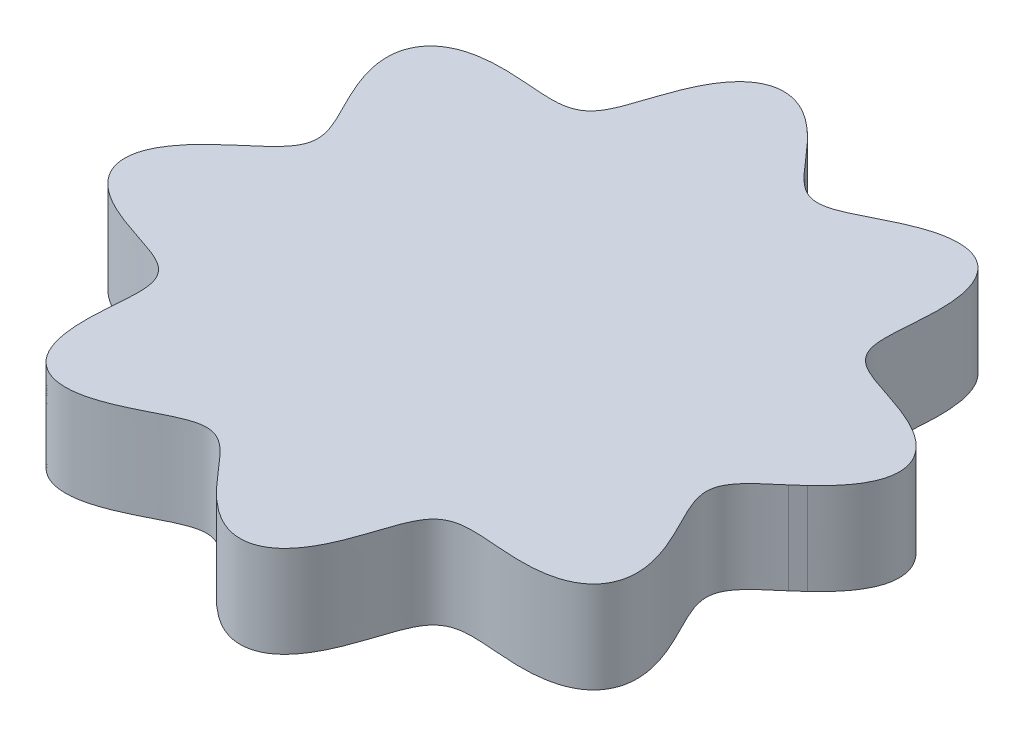
ISO-10303-21;
HEADER;
FILE_DESCRIPTION(('STEP AP214'),'2;1');
FILE_NAME('part.step','',(''),(''),'','','');
FILE_SCHEMA(('AUTOMOTIVE_DESIGN { 1 0 10303 214 1 1 1 1 }'));
ENDSEC;
DATA;
#1=APPLICATION_CONTEXT('core data for automotive mechanical design processes');
#2=APPLICATION_PROTOCOL_DEFINITION('international standard','automotive_design',2000,#1);
#3=PRODUCT_CONTEXT('',#1,'mechanical');
#4=PRODUCT('Part','Part','',(#3));
#5=PRODUCT_RELATED_PRODUCT_CATEGORY('part','',(#4));
#6=PRODUCT_DEFINITION_FORMATION('','',#4);
#7=PRODUCT_DEFINITION_CONTEXT('part definition',#1,'design');
#8=PRODUCT_DEFINITION('design','',#6,#7);
#9=PRODUCT_DEFINITION_SHAPE('','',#8);
#10=(LENGTH_UNIT() NAMED_UNIT(*) SI_UNIT(.MILLI.,.METRE.));
#11=(NAMED_UNIT(*) PLANE_ANGLE_UNIT() SI_UNIT($,.RADIAN.));
#12=(NAMED_UNIT(*) SI_UNIT($,.STERADIAN.) SOLID_ANGLE_UNIT());
#13=UNCERTAINTY_MEASURE_WITH_UNIT(LENGTH_MEASURE(1.E-05),#10,'distance_accuracy_value','');
#14=(GEOMETRIC_REPRESENTATION_CONTEXT(3) GLOBAL_UNCERTAINTY_ASSIGNED_CONTEXT((#13)) GLOBAL_UNIT_ASSIGNED_CONTEXT((#10,
#11,#12)) REPRESENTATION_CONTEXT('',''));
#15=CARTESIAN_POINT('',(0.,0.,0.));
#16=DIRECTION('',(0.,0.,1.));
#17=DIRECTION('',(1.,0.,0.));
#18=AXIS2_PLACEMENT_3D('',#15,#16,#17);
#19=CARTESIAN_POINT('',(7.14778137298853,2.3,0.224628079047248));
#20=DIRECTION('',(-0.665080931968554,0.,-0.746771286226138));
#21=DIRECTION('',(-0.746771286226138,0.,0.665080931968554));
#22=AXIS2_PLACEMENT_3D('',#19,#20,#21);
#23=PLANE('',#22);
#24=CARTESIAN_POINT('',(7.14778137298853,0.,0.224628079047248));
#25=CARTESIAN_POINT('',(7.4,0.,0.));
#26=B_SPLINE_CURVE_WITH_KNOTS('',1,(#24,#25),.UNSPECIFIED.,.F.,.F.,(2,2),(0.,1.),.UNSPECIFIED.);
#27=CARTESIAN_POINT('',(7.14778137298853,0.,0.224628079047248));
#28=VERTEX_POINT('',#27);
#29=CARTESIAN_POINT('',(7.4,0.,0.));
#30=VERTEX_POINT('',#29);
#31=EDGE_CURVE('E76',#28,#30,#26,.T.);
#32=ORIENTED_EDGE('',*,*,#31,.T.);
#33=DIRECTION('',(0.,-1.,0.));
#34=VECTOR('',#33,1.);
#35=CARTESIAN_POINT('',(7.4,2.3,0.));
#36=LINE('',#35,#34);
#37=CARTESIAN_POINT('',(7.4,2.3,0.));
#38=VERTEX_POINT('',#37);
#39=EDGE_CURVE('E11',#38,#30,#36,.T.);
#40=ORIENTED_EDGE('',*,*,#39,.F.);
#41=CARTESIAN_POINT('',(7.14778137298853,2.3,0.224628079047248));
#42=CARTESIAN_POINT('',(7.4,2.3,0.));
#43=B_SPLINE_CURVE_WITH_KNOTS('',1,(#41,#42),.UNSPECIFIED.,.F.,.F.,(2,2),(0.,1.),.UNSPECIFIED.);
#44=CARTESIAN_POINT('',(7.14778137298853,2.3,0.224628079047248));
#45=VERTEX_POINT('',#44);
#46=EDGE_CURVE('E75',#45,#38,#43,.T.);
#47=ORIENTED_EDGE('',*,*,#46,.F.);
#48=DIRECTION('',(0.,-1.,0.));
#49=VECTOR('',#48,1.);
#50=CARTESIAN_POINT('',(7.14778137298853,2.3,0.224628079047248));
#51=LINE('',#50,#49);
#52=EDGE_CURVE('E52',#45,#28,#51,.T.);
#53=ORIENTED_EDGE('',*,*,#52,.T.);
#54=EDGE_LOOP('',(#32,#40,#47,#53));
#55=FACE_BOUND('',#54,.T.);
#56=ADVANCED_FACE('F43',(#55),#23,.F.);
#57=CARTESIAN_POINT('',(7.4,2.3,0.));
#58=CARTESIAN_POINT('',(7.4364446369576,2.3,-0.0337112891857806));
#59=CARTESIAN_POINT('',(7.50739333248502,2.3,-0.10115075950707));
#60=CARTESIAN_POINT('',(7.67750733309035,2.3,-0.26781720975571));
#61=CARTESIAN_POINT('',(7.80304640941041,2.3,-0.414528224709537));
#62=CARTESIAN_POINT('',(7.9667135118129,2.3,-0.62003866109271));
#63=CARTESIAN_POINT('',(8.08371507759827,2.3,-0.813084973767404));
#64=CARTESIAN_POINT('',(8.18928037551377,2.3,-1.0337068303071));
#65=CARTESIAN_POINT('',(8.25108435441691,2.3,-1.26191598946158));
#66=CARTESIAN_POINT('',(8.27154648896368,2.3,-1.54509859521035));
#67=CARTESIAN_POINT('',(8.1940831750925,2.3,-1.8656057387664));
#68=CARTESIAN_POINT('',(7.9809905480171,2.3,-2.1818735991208));
#69=CARTESIAN_POINT('',(7.65088872757395,2.3,-2.45187296343531));
#70=CARTESIAN_POINT('',(7.27274231404372,2.3,-2.66101728888248));
#71=CARTESIAN_POINT('',(6.86706923873528,2.3,-2.82681644475663));
#72=CARTESIAN_POINT('',(6.49186318051521,2.3,-2.95270405146126));
#73=CARTESIAN_POINT('',(6.15587025871581,2.3,-3.06045197560471));
#74=CARTESIAN_POINT('',(5.86283978667274,2.3,-3.16581754765754));
#75=CARTESIAN_POINT('',(5.61904372309469,2.3,-3.27796671747519));
#76=CARTESIAN_POINT('',(5.39525962845809,2.3,-3.43274613210952));
#77=CARTESIAN_POINT('',(5.24002571250461,2.3,-3.66090413969987));
#78=CARTESIAN_POINT('',(5.17988681537216,2.3,-3.9264346536735));
#79=CARTESIAN_POINT('',(5.16828693731276,2.3,-4.19423740971475));
#80=CARTESIAN_POINT('',(5.18245298574087,2.3,-4.50516590456582));
#81=CARTESIAN_POINT('',(5.21124821420998,2.3,-4.85636008663411));
#82=CARTESIAN_POINT('',(5.23916665117113,2.3,-5.25103749008237));
#83=CARTESIAN_POINT('',(5.24188271290209,2.3,-5.68852370857243));
#84=CARTESIAN_POINT('',(5.19573250449093,2.3,-6.11821154326804));
#85=CARTESIAN_POINT('',(5.0746213018994,2.3,-6.52613424417574));
#86=CARTESIAN_POINT('',(4.84388573370803,2.3,-6.88601419386851));
#87=CARTESIAN_POINT('',(4.48508851059114,2.3,-7.11998531538029));
#88=CARTESIAN_POINT('',(4.0599231074999,2.3,-7.18667411879684));
#89=CARTESIAN_POINT('',(3.63230080788659,2.3,-7.13475396918707));
#90=CARTESIAN_POINT('',(3.21666920684279,2.3,-7.00753925331763));
#91=CARTESIAN_POINT('',(2.8151242545183,2.3,-6.83504783154169));
#92=CARTESIAN_POINT('',(2.46332137744694,2.3,-6.6580229774624));
#93=CARTESIAN_POINT('',(2.15258565693958,2.3,-6.49871750035118));
#94=CARTESIAN_POINT('',(1.87412393733703,2.3,-6.37047999630577));
#95=CARTESIAN_POINT('',(1.62689903142331,2.3,-6.28330303322878));
#96=CARTESIAN_POINT('',(1.36627566290195,2.3,-6.24357979170338));
#97=CARTESIAN_POINT('',(1.10834841423531,2.3,-6.29989842233128));
#98=CARTESIAN_POINT('',(0.890210519133311,2.3,-6.43745264242744));
#99=CARTESIAN_POINT('',(0.702843738167899,2.3,-6.60675668146296));
#100=CARTESIAN_POINT('',(0.499191358604003,2.3,-6.82680076803962));
#101=CARTESIAN_POINT('',(0.27487146052644,2.3,-7.09054961888214));
#102=CARTESIAN_POINT('',(0.054000713326188,2.3,-7.34687184487833));
#103=CARTESIAN_POINT('',(-0.174123606000438,2.3,-7.58617857120942));
#104=CARTESIAN_POINT('',(-0.417055242430458,2.3,-7.80979489420886));
#105=CARTESIAN_POINT('',(-0.672951622572464,2.3,-8.00846661566087));
#106=CARTESIAN_POINT('',(-0.997608379471692,2.3,-8.19138156877601));
#107=CARTESIAN_POINT('',(-1.41172476954322,2.3,-8.29286360850647));
#108=CARTESIAN_POINT('',(-1.82908563923514,2.3,-8.21977579912678));
#109=CARTESIAN_POINT('',(-2.18145385525609,2.3,-7.98064201864568));
#110=CARTESIAN_POINT('',(-2.45190270122348,2.3,-7.65147197897087));
#111=CARTESIAN_POINT('',(-2.66080692843555,2.3,-7.27270983398022));
#112=CARTESIAN_POINT('',(-2.82681188714922,2.3,-6.86745633626634));
#113=CARTESIAN_POINT('',(-2.95258978490566,2.3,-6.49197300130625));
#114=CARTESIAN_POINT('',(-3.06040980671502,2.3,-6.15613609964682));
#115=CARTESIAN_POINT('',(-3.16572484515621,2.3,-5.86300715002778));
#116=CARTESIAN_POINT('',(-3.27787514255978,2.3,-5.61924431016007));
#117=CARTESIAN_POINT('',(-3.43259573899734,2.3,-5.39540448198407));
#118=CARTESIAN_POINT('',(-3.66070918242398,2.3,-5.24011070141859));
#119=CARTESIAN_POINT('',(-3.92622548715151,2.3,-5.17990550870602));
#120=CARTESIAN_POINT('',(-4.19402497313494,2.3,-5.1682873340776));
#121=CARTESIAN_POINT('',(-4.50494775122741,2.3,-5.18243486831326));
#122=CARTESIAN_POINT('',(-4.85613679786299,2.3,-5.21123073527447));
#123=CARTESIAN_POINT('',(-5.25080612424998,2.3,-5.23915530598533));
#124=CARTESIAN_POINT('',(-5.68828466364061,2.3,-5.24189218855607));
#125=CARTESIAN_POINT('',(-6.11796766940204,2.3,-5.19577736102272));
#126=CARTESIAN_POINT('',(-6.52589749227728,2.3,-5.07472122353587));
#127=CARTESIAN_POINT('',(-6.88582005711073,2.3,-4.84407015831848));
#128=CARTESIAN_POINT('',(-7.11989553977434,2.3,-4.48534091668227));
#129=CARTESIAN_POINT('',(-7.18667732017427,2.3,-4.06017957330342));
#130=CARTESIAN_POINT('',(-7.13480859653565,2.3,-3.63254255106833));
#131=CARTESIAN_POINT('',(-7.00762454617519,2.3,-3.21689236486575));
#132=CARTESIAN_POINT('',(-6.83514638644374,2.3,-2.81533336795424));
#133=CARTESIAN_POINT('',(-6.65812685079254,2.3,-2.4635198207748));
#134=CARTESIAN_POINT('',(-6.49881358534678,2.3,-2.15278141233678));
#135=CARTESIAN_POINT('',(-6.37056462873318,2.3,-1.87431912573865));
#136=CARTESIAN_POINT('',(-6.2833546440991,2.3,-1.62710288729925));
#137=CARTESIAN_POINT('',(-6.24358464172051,2.3,-1.3664842140672));
#138=CARTESIAN_POINT('',(-6.29980298823697,2.3,-1.10854824064232));
#139=CARTESIAN_POINT('',(-6.43734090294561,2.3,-0.890363330299384));
#140=CARTESIAN_POINT('',(-6.60657374992722,2.3,-0.703013254866076));
#141=CARTESIAN_POINT('',(-6.8266988400641,2.3,-0.49929577509866));
#142=CARTESIAN_POINT('',(-7.09026164476207,2.3,-0.275087004430252));
#143=CARTESIAN_POINT('',(-7.38860941576109,2.3,-0.0180949585354893));
#144=CARTESIAN_POINT('',(-7.70421032754583,2.3,0.289040509641875));
#145=CARTESIAN_POINT('',(-7.98101945849573,2.3,0.624445207526329));
#146=CARTESIAN_POINT('',(-8.19134839033353,2.3,0.997414225323231));
#147=CARTESIAN_POINT('',(-8.29281173417125,2.3,1.41143578267147));
#148=CARTESIAN_POINT('',(-8.21990398261336,2.3,1.82885323215188));
#149=CARTESIAN_POINT('',(-7.98080594132467,2.3,2.18126004926334));
#150=CARTESIAN_POINT('',(-7.65169055009738,2.3,2.45177355152918));
#151=CARTESIAN_POINT('',(-7.27291951227012,2.3,2.66070160554164));
#152=CARTESIAN_POINT('',(-6.86767900991627,2.3,2.8267360949514));
#153=CARTESIAN_POINT('',(-6.49218372124508,2.3,2.95251919706365));
#154=CARTESIAN_POINT('',(-6.15634517370247,2.3,3.06034307336585));
#155=CARTESIAN_POINT('',(-5.8632047639889,2.3,3.16564523305477));
#156=CARTESIAN_POINT('',(-5.61942837345998,2.3,3.27777645451163));
#157=CARTESIAN_POINT('',(-5.39555860569029,2.3,3.43244935733125));
#158=CARTESIAN_POINT('',(-5.24019007474424,2.3,3.66051183995768));
#159=CARTESIAN_POINT('',(-5.17992812339109,2.3,3.92601791382495));
#160=CARTESIAN_POINT('',(-5.16828504550022,2.3,4.19381153908632));
#161=CARTESIAN_POINT('',(-5.18241873781466,2.3,4.50473013762793));
#162=CARTESIAN_POINT('',(-5.21121151121235,2.3,4.85591332312381));
#163=CARTESIAN_POINT('',(-5.23914577353674,2.3,5.25057462571835));
#164=CARTESIAN_POINT('',(-5.24189953556087,2.3,5.68804605503848));
#165=CARTESIAN_POINT('',(-5.19582500105305,2.3,6.1177230032648));
#166=CARTESIAN_POINT('',(-5.07481747083391,2.3,6.52566184453039));
#167=CARTESIAN_POINT('',(-4.84425980889232,2.3,6.88562418563494));
#168=CARTESIAN_POINT('',(-4.48558487346291,2.3,7.11980842282117));
#169=CARTESIAN_POINT('',(-4.06045126418924,2.3,7.18667552616053));
#170=CARTESIAN_POINT('',(-3.63275673911294,2.3,7.13487219128278));
#171=CARTESIAN_POINT('',(-3.21716814773412,2.3,7.00769263948216));
#172=CARTESIAN_POINT('',(-2.8154502165919,2.3,6.83527509872015));
#173=CARTESIAN_POINT('',(-2.40526642119976,2.3,6.62867505895501));
#174=CARTESIAN_POINT('',(-2.03630074271327,2.3,6.43910926944699));
#175=CARTESIAN_POINT('',(-1.69289066166461,2.3,6.29351870921747));
#176=CARTESIAN_POINT('',(-1.3667765971147,2.3,6.24355767881712));
#177=CARTESIAN_POINT('',(-1.10869116108611,2.3,6.2997339420609));
#178=CARTESIAN_POINT('',(-0.890561515168708,2.3,6.43720043439611));
#179=CARTESIAN_POINT('',(-0.703140927411732,2.3,6.60642972454974));
#180=CARTESIAN_POINT('',(-0.499452587981176,2.3,6.82652967272655));
#181=CARTESIAN_POINT('',(-0.27522232868719,2.3,7.0900934134841));
#182=CARTESIAN_POINT('',(-0.0182552226204815,2.3,7.38843605468022));
#183=CARTESIAN_POINT('',(0.288869925457536,2.3,7.70404737293993));
#184=CARTESIAN_POINT('',(0.624241461782572,2.3,7.98087567559077));
#185=CARTESIAN_POINT('',(0.99717954960203,2.3,8.19124734617357));
#186=CARTESIAN_POINT('',(1.41116843059748,2.3,8.29279598893176));
#187=CARTESIAN_POINT('',(1.82860738068987,2.3,8.22000964932682));
#188=CARTESIAN_POINT('',(2.18107527258231,2.3,7.98098500548442));
#189=CARTESIAN_POINT('',(2.45163765752106,2.3,7.65189785735333));
#190=CARTESIAN_POINT('',(2.66060079762426,2.3,7.27313676045569));
#191=CARTESIAN_POINT('',(2.8266572023888,2.3,6.86789652070164));
#192=CARTESIAN_POINT('',(2.952450512386,2.3,6.4923976085038));
#193=CARTESIAN_POINT('',(3.06027526140774,2.3,6.15655248036733));
#194=CARTESIAN_POINT('',(3.1655662230926,2.3,5.86340330887153));
#195=CARTESIAN_POINT('',(3.2776774480546,2.3,5.61961197288617));
#196=CARTESIAN_POINT('',(3.43230324232795,2.3,5.39571299276431));
#197=CARTESIAN_POINT('',(3.66031433829797,2.3,5.24026944433666));
#198=CARTESIAN_POINT('',(3.92581054511656,2.3,5.17995068384147));
#199=CARTESIAN_POINT('',(4.19359781538575,2.3,5.16828306013812));
#200=CARTESIAN_POINT('',(4.50451301321034,2.3,5.18240197320841));
#201=CARTESIAN_POINT('',(4.85568901491951,2.3,5.21119347399723));
#202=CARTESIAN_POINT('',(5.25034446829263,2.3,5.23913426817115));
#203=CARTESIAN_POINT('',(5.68780549330238,2.3,5.24190976547781));
#204=CARTESIAN_POINT('',(6.11748122426767,2.3,5.19586830942286));
#205=CARTESIAN_POINT('',(6.52542230218624,2.3,5.07491946728366));
#206=CARTESIAN_POINT('',(6.88543399772981,2.3,4.84444085295716));
#207=CARTESIAN_POINT('',(7.11971203672891,2.3,4.4858425325387));
#208=CARTESIAN_POINT('',(7.18669035711805,2.3,4.06069811546236));
#209=CARTESIAN_POINT('',(7.13490552338132,2.3,3.63301591515928));
#210=CARTESIAN_POINT('',(7.00781874218925,2.3,3.21735824065666));
#211=CARTESIAN_POINT('',(6.83530071394441,2.3,2.81571621398698));
#212=CARTESIAN_POINT('',(6.65840436598719,2.3,2.46397474967717));
#213=CARTESIAN_POINT('',(6.51385084543318,2.3,2.18222540322583));
#214=CARTESIAN_POINT('',(6.41203261070134,2.3,1.96427534769838));
#215=CARTESIAN_POINT('',(6.35039373382024,2.3,1.81241027570031));
#216=CARTESIAN_POINT('',(6.30808533509231,2.3,1.68819985332694));
#217=CARTESIAN_POINT('',(6.27628571232343,2.3,1.56079312354032));
#218=CARTESIAN_POINT('',(6.25968514880944,2.3,1.43033189833938));
#219=CARTESIAN_POINT('',(6.26410309415349,2.3,1.2890275135736));
#220=CARTESIAN_POINT('',(6.29930746929764,2.3,1.14188498196766));
#221=CARTESIAN_POINT('',(6.36013821545326,2.3,1.01628588907594));
#222=CARTESIAN_POINT('',(6.43143066580904,2.3,0.910575207070645));
#223=CARTESIAN_POINT('',(6.49626982432872,2.3,0.829097917716659));
#224=CARTESIAN_POINT('',(6.55207505945493,2.3,0.765972050039966));
#225=CARTESIAN_POINT('',(6.67005900222285,2.3,0.645444464584634));
#226=CARTESIAN_POINT('',(6.77101303905092,2.3,0.548468498849544));
#227=CARTESIAN_POINT('',(6.99341077942513,2.3,0.357126576655739));
#228=CARTESIAN_POINT('',(7.09438920867496,2.3,0.270884646526839));
#229=CARTESIAN_POINT('',(7.14778137298853,2.3,0.224628079047248));
#230=B_SPLINE_CURVE_WITH_KNOTS('',4,(#57,#58,#59,#60,#61,#62,#63,#64,#65,#66,#67,#68,#69,#70,
#71,#72,#73,#74,#75,#76,#77,#78,#79,#80,#81,#82,#83,#84,#85,#86,#87,#88,#89,#90,#91,#92,#93,#94,
#95,#96,#97,#98,#99,#100,#101,#102,#103,#104,#105,#106,#107,#108,#109,#110,#111,#112,#113,#114,
#115,#116,#117,#118,#119,#120,#121,#122,#123,#124,#125,#126,#127,#128,#129,#130,#131,#132,#133,
#134,#135,#136,#137,#138,#139,#140,#141,#142,#143,#144,#145,#146,#147,#148,#149,#150,#151,#152,
#153,#154,#155,#156,#157,#158,#159,#160,#161,#162,#163,#164,#165,#166,#167,#168,#169,#170,#171,
#172,#173,#174,#175,#176,#177,#178,#179,#180,#181,#182,#183,#184,#185,#186,#187,#188,#189,#190,
#191,#192,#193,#194,#195,#196,#197,#198,#199,#200,#201,#202,#203,#204,#205,#206,#207,#208,#209,
#210,#211,#212,#213,#214,#215,#216,#217,#218,#219,#220,#221,#222,#223,#224,#225,#226,#227,#228,
#229),.UNSPECIFIED.,.F.,.F.,(5,1,1,1,1,1,1,1,1,1,1,1,1,1,1,1,1,1,1,1,1,1,1,1,1,1,1,1,1,1,1,1,1,
1,1,1,1,1,1,1,1,1,1,1,1,1,1,1,1,1,1,1,1,1,1,1,1,1,1,1,1,1,1,1,1,1,1,1,1,1,1,1,1,1,1,1,1,1,1,1,1,
1,1,1,1,1,1,1,1,1,1,1,1,1,1,1,1,1,1,1,1,1,1,1,1,1,1,1,1,1,1,1,1,1,1,1,1,1,1,1,1,1,1,1,1,1,1,1,1,
1,1,1,1,1,1,1,1,1,1,1,1,1,1,1,1,1,1,1,1,1,1,1,1,1,1,1,1,1,1,1,1,1,1,1,1,1,1,1,1,5),
(0.0816172743251041,0.0850586013331269,0.0884999283411497,0.0919412553491725,0.0953825823571953,
0.0988239093652181,0.102265236373241,0.105706563381264,0.109147890389287,0.115060177385027,
0.120972464380767,0.127308553803218,0.133644643225668,0.139980732648119,0.146316822070569,
0.150202057638161,0.154087293205753,0.157972528773344,0.161857764340936,0.165739586621514,
0.169621408902092,0.173503231182669,0.177385053463247,0.183715618605088,0.190046183746929,
0.19637674888877,0.202707314030611,0.208614489213244,0.214521664395877,0.220593376761121,
0.226665089126365,0.23298995011563,0.239314811104896,0.245639672094161,0.251964533083426,
0.255758753586819,0.259552974090213,0.263347194593606,0.267141415097,0.270794178232474,
0.274446941367948,0.278099704503422,0.281752467638896,0.288124872800812,0.294497277962727,
0.297683480543685,0.300869683124643,0.307242088286558,0.313188370988242,0.319134653689925,
0.325047042064416,0.330959430438907,0.337295629008497,0.343631827578087,0.349968026147677,
0.356304224717267,0.360189528093608,0.364074831469949,0.36796013484629,0.371845438222631,
0.375727193138661,0.379608948054691,0.383490702970721,0.387372457886751,0.393702913396499,
0.400033368906247,0.406363824415994,0.412694279925742,0.418601354046429,0.424508428167117,
0.430580242699607,0.436652057232098,0.442977028785091,0.449302000338085,0.455626971891078,
0.461951943444071,0.465746229642745,0.469540515841418,0.473334802040091,0.477129088238765,
0.480781786087606,0.484434483936447,0.488087181785288,0.491739879634129,0.498112174177926,
0.504484468721723,0.51085676326552,0.517229057809318,0.523175237406699,0.52912141700408,
0.535033906763041,0.540946396522003,0.547282704229079,0.553619011936155,0.559955319643231,
0.566291627350307,0.570176998543647,0.574062369736987,0.577947740930327,0.581833112123666,
0.585714799684142,0.589596487244618,0.593478174805094,0.59735986236557,0.603690208234056,
0.610020554102541,0.616350899971026,0.622681245839511,0.628588218904829,0.634495191970147,
0.640567108677549,0.646639025384952,0.652964107492948,0.659289189600945,0.665614271708942,
0.671939353816938,0.679528057623784,0.683322409527207,0.687116761430629,0.69076939399768,
0.694422026564731,0.698074659131781,0.701727291698832,0.708099475609631,0.714471659520429,
0.720843843431228,0.727216027342027,0.733162103836199,0.73910818033037,0.745020771479506,
0.750933362628642,0.757269779463543,0.763606196298443,0.769942613133344,0.776279029968245,
0.780164468986817,0.78404990800539,0.787935347023963,0.791820786042536,0.795702406256465,
0.799584026470395,0.803465646684324,0.807347266898253,0.813677503116317,0.820007739334381,
0.826337975552445,0.832668211770509,0.838575083787048,0.844481955803587,0.850553974693552,
0.856625993583516,0.862951186237778,0.86927637889204,0.875601571546302,0.881926764200564,
0.885721181818194,0.887618390627009,0.889515599435824,0.891412808244639,0.893310017053454,
0.895207225862269,0.897104434671084,0.899552847216843,0.902001259762602,0.903225466035481,
0.904449672308361,0.90567387858124,0.906898084854119,0.911794909945637,0.916691735037155),.UNSPECIFIED.);
#231=DIRECTION('',(0.,-1.,0.));
#232=VECTOR('',#231,1.);
#233=SURFACE_OF_LINEAR_EXTRUSION('',#230,#232);
#234=CARTESIAN_POINT('',(7.4,0.,0.));
#235=CARTESIAN_POINT('',(7.4364446369576,0.,-0.0337112891857806));
#236=CARTESIAN_POINT('',(7.50739333248502,0.,-0.10115075950707));
#237=CARTESIAN_POINT('',(7.67750733309035,0.,-0.26781720975571));
#238=CARTESIAN_POINT('',(7.80304640941041,0.,-0.414528224709537));
#239=CARTESIAN_POINT('',(7.9667135118129,0.,-0.62003866109271));
#240=CARTESIAN_POINT('',(8.08371507759827,0.,-0.813084973767404));
#241=CARTESIAN_POINT('',(8.18928037551377,0.,-1.0337068303071));
#242=CARTESIAN_POINT('',(8.25108435441691,0.,-1.26191598946158));
#243=CARTESIAN_POINT('',(8.27154648896368,0.,-1.54509859521035));
#244=CARTESIAN_POINT('',(8.1940831750925,0.,-1.8656057387664));
#245=CARTESIAN_POINT('',(7.9809905480171,0.,-2.1818735991208));
#246=CARTESIAN_POINT('',(7.65088872757395,0.,-2.45187296343531));
#247=CARTESIAN_POINT('',(7.27274231404372,0.,-2.66101728888248));
#248=CARTESIAN_POINT('',(6.86706923873528,0.,-2.82681644475663));
#249=CARTESIAN_POINT('',(6.49186318051521,0.,-2.95270405146126));
#250=CARTESIAN_POINT('',(6.15587025871581,0.,-3.06045197560471));
#251=CARTESIAN_POINT('',(5.86283978667274,0.,-3.16581754765754));
#252=CARTESIAN_POINT('',(5.61904372309469,0.,-3.27796671747519));
#253=CARTESIAN_POINT('',(5.39525962845809,0.,-3.43274613210952));
#254=CARTESIAN_POINT('',(5.24002571250461,0.,-3.66090413969987));
#255=CARTESIAN_POINT('',(5.17988681537216,0.,-3.9264346536735));
#256=CARTESIAN_POINT('',(5.16828693731276,0.,-4.19423740971475));
#257=CARTESIAN_POINT('',(5.18245298574087,0.,-4.50516590456582));
#258=CARTESIAN_POINT('',(5.21124821420998,0.,-4.85636008663411));
#259=CARTESIAN_POINT('',(5.23916665117113,0.,-5.25103749008237));
#260=CARTESIAN_POINT('',(5.24188271290209,0.,-5.68852370857243));
#261=CARTESIAN_POINT('',(5.19573250449093,0.,-6.11821154326804));
#262=CARTESIAN_POINT('',(5.0746213018994,0.,-6.52613424417574));
#263=CARTESIAN_POINT('',(4.84388573370803,0.,-6.88601419386851));
#264=CARTESIAN_POINT('',(4.48508851059114,0.,-7.11998531538029));
#265=CARTESIAN_POINT('',(4.0599231074999,0.,-7.18667411879684));
#266=CARTESIAN_POINT('',(3.63230080788659,0.,-7.13475396918707));
#267=CARTESIAN_POINT('',(3.21666920684279,0.,-7.00753925331763));
#268=CARTESIAN_POINT('',(2.8151242545183,0.,-6.83504783154169));
#269=CARTESIAN_POINT('',(2.46332137744694,0.,-6.6580229774624));
#270=CARTESIAN_POINT('',(2.15258565693958,0.,-6.49871750035118));
#271=CARTESIAN_POINT('',(1.87412393733703,0.,-6.37047999630577));
#272=CARTESIAN_POINT('',(1.62689903142331,0.,-6.28330303322878));
#273=CARTESIAN_POINT('',(1.36627566290195,0.,-6.24357979170338));
#274=CARTESIAN_POINT('',(1.10834841423531,0.,-6.29989842233128));
#275=CARTESIAN_POINT('',(0.890210519133311,0.,-6.43745264242744));
#276=CARTESIAN_POINT('',(0.702843738167899,0.,-6.60675668146296));
#277=CARTESIAN_POINT('',(0.499191358604003,0.,-6.82680076803962));
#278=CARTESIAN_POINT('',(0.27487146052644,0.,-7.09054961888214));
#279=CARTESIAN_POINT('',(0.054000713326188,0.,-7.34687184487833));
#280=CARTESIAN_POINT('',(-0.174123606000438,0.,-7.58617857120942));
#281=CARTESIAN_POINT('',(-0.417055242430458,0.,-7.80979489420886));
#282=CARTESIAN_POINT('',(-0.672951622572464,0.,-8.00846661566087));
#283=CARTESIAN_POINT('',(-0.997608379471692,0.,-8.19138156877601));
#284=CARTESIAN_POINT('',(-1.41172476954322,0.,-8.29286360850647));
#285=CARTESIAN_POINT('',(-1.82908563923514,0.,-8.21977579912678));
#286=CARTESIAN_POINT('',(-2.18145385525609,0.,-7.98064201864568));
#287=CARTESIAN_POINT('',(-2.45190270122348,0.,-7.65147197897087));
#288=CARTESIAN_POINT('',(-2.66080692843555,0.,-7.27270983398022));
#289=CARTESIAN_POINT('',(-2.82681188714922,0.,-6.86745633626634));
#290=CARTESIAN_POINT('',(-2.95258978490566,0.,-6.49197300130625));
#291=CARTESIAN_POINT('',(-3.06040980671502,0.,-6.15613609964682));
#292=CARTESIAN_POINT('',(-3.16572484515621,0.,-5.86300715002778));
#293=CARTESIAN_POINT('',(-3.27787514255978,0.,-5.61924431016007));
#294=CARTESIAN_POINT('',(-3.43259573899734,0.,-5.39540448198407));
#295=CARTESIAN_POINT('',(-3.66070918242398,0.,-5.24011070141859));
#296=CARTESIAN_POINT('',(-3.92622548715151,0.,-5.17990550870602));
#297=CARTESIAN_POINT('',(-4.19402497313494,0.,-5.1682873340776));
#298=CARTESIAN_POINT('',(-4.50494775122741,0.,-5.18243486831326));
#299=CARTESIAN_POINT('',(-4.85613679786299,0.,-5.21123073527447));
#300=CARTESIAN_POINT('',(-5.25080612424998,0.,-5.23915530598533));
#301=CARTESIAN_POINT('',(-5.68828466364061,0.,-5.24189218855607));
#302=CARTESIAN_POINT('',(-6.11796766940204,0.,-5.19577736102272));
#303=CARTESIAN_POINT('',(-6.52589749227728,0.,-5.07472122353587));
#304=CARTESIAN_POINT('',(-6.88582005711073,0.,-4.84407015831848));
#305=CARTESIAN_POINT('',(-7.11989553977434,0.,-4.48534091668227));
#306=CARTESIAN_POINT('',(-7.18667732017427,0.,-4.06017957330342));
#307=CARTESIAN_POINT('',(-7.13480859653565,0.,-3.63254255106833));
#308=CARTESIAN_POINT('',(-7.00762454617519,0.,-3.21689236486575));
#309=CARTESIAN_POINT('',(-6.83514638644374,0.,-2.81533336795424));
#310=CARTESIAN_POINT('',(-6.65812685079254,0.,-2.4635198207748));
#311=CARTESIAN_POINT('',(-6.49881358534678,0.,-2.15278141233678));
#312=CARTESIAN_POINT('',(-6.37056462873318,0.,-1.87431912573865));
#313=CARTESIAN_POINT('',(-6.2833546440991,0.,-1.62710288729925));
#314=CARTESIAN_POINT('',(-6.24358464172051,0.,-1.3664842140672));
#315=CARTESIAN_POINT('',(-6.29980298823697,0.,-1.10854824064232));
#316=CARTESIAN_POINT('',(-6.43734090294561,0.,-0.890363330299384));
#317=CARTESIAN_POINT('',(-6.60657374992722,0.,-0.703013254866076));
#318=CARTESIAN_POINT('',(-6.8266988400641,0.,-0.49929577509866));
#319=CARTESIAN_POINT('',(-7.09026164476207,0.,-0.275087004430252));
#320=CARTESIAN_POINT('',(-7.38860941576109,0.,-0.0180949585354893));
#321=CARTESIAN_POINT('',(-7.70421032754583,0.,0.289040509641875));
#322=CARTESIAN_POINT('',(-7.98101945849573,0.,0.624445207526329));
#323=CARTESIAN_POINT('',(-8.19134839033353,0.,0.997414225323231));
#324=CARTESIAN_POINT('',(-8.29281173417125,0.,1.41143578267147));
#325=CARTESIAN_POINT('',(-8.21990398261336,0.,1.82885323215188));
#326=CARTESIAN_POINT('',(-7.98080594132467,0.,2.18126004926334));
#327=CARTESIAN_POINT('',(-7.65169055009738,0.,2.45177355152918));
#328=CARTESIAN_POINT('',(-7.27291951227012,0.,2.66070160554164));
#329=CARTESIAN_POINT('',(-6.86767900991627,0.,2.8267360949514));
#330=CARTESIAN_POINT('',(-6.49218372124508,0.,2.95251919706365));
#331=CARTESIAN_POINT('',(-6.15634517370247,0.,3.06034307336585));
#332=CARTESIAN_POINT('',(-5.8632047639889,0.,3.16564523305477));
#333=CARTESIAN_POINT('',(-5.61942837345998,0.,3.27777645451163));
#334=CARTESIAN_POINT('',(-5.39555860569029,0.,3.43244935733125));
#335=CARTESIAN_POINT('',(-5.24019007474424,0.,3.66051183995768));
#336=CARTESIAN_POINT('',(-5.17992812339109,0.,3.92601791382495));
#337=CARTESIAN_POINT('',(-5.16828504550022,0.,4.19381153908632));
#338=CARTESIAN_POINT('',(-5.18241873781466,0.,4.50473013762793));
#339=CARTESIAN_POINT('',(-5.21121151121235,0.,4.85591332312381));
#340=CARTESIAN_POINT('',(-5.23914577353674,0.,5.25057462571835));
#341=CARTESIAN_POINT('',(-5.24189953556087,0.,5.68804605503848));
#342=CARTESIAN_POINT('',(-5.19582500105305,0.,6.1177230032648));
#343=CARTESIAN_POINT('',(-5.07481747083391,0.,6.52566184453039));
#344=CARTESIAN_POINT('',(-4.84425980889232,0.,6.88562418563494));
#345=CARTESIAN_POINT('',(-4.48558487346291,0.,7.11980842282117));
#346=CARTESIAN_POINT('',(-4.06045126418924,0.,7.18667552616053));
#347=CARTESIAN_POINT('',(-3.63275673911294,0.,7.13487219128278));
#348=CARTESIAN_POINT('',(-3.21716814773412,0.,7.00769263948216));
#349=CARTESIAN_POINT('',(-2.8154502165919,0.,6.83527509872015));
#350=CARTESIAN_POINT('',(-2.40526642119976,0.,6.62867505895501));
#351=CARTESIAN_POINT('',(-2.03630074271327,0.,6.43910926944699));
#352=CARTESIAN_POINT('',(-1.69289066166461,0.,6.29351870921747));
#353=CARTESIAN_POINT('',(-1.3667765971147,0.,6.24355767881712));
#354=CARTESIAN_POINT('',(-1.10869116108611,0.,6.2997339420609));
#355=CARTESIAN_POINT('',(-0.890561515168708,0.,6.43720043439611));
#356=CARTESIAN_POINT('',(-0.703140927411732,0.,6.60642972454974));
#357=CARTESIAN_POINT('',(-0.499452587981176,0.,6.82652967272655));
#358=CARTESIAN_POINT('',(-0.27522232868719,0.,7.0900934134841));
#359=CARTESIAN_POINT('',(-0.0182552226204815,0.,7.38843605468022));
#360=CARTESIAN_POINT('',(0.288869925457536,0.,7.70404737293993));
#361=CARTESIAN_POINT('',(0.624241461782572,0.,7.98087567559077));
#362=CARTESIAN_POINT('',(0.99717954960203,0.,8.19124734617357));
#363=CARTESIAN_POINT('',(1.41116843059748,0.,8.29279598893176));
#364=CARTESIAN_POINT('',(1.82860738068987,0.,8.22000964932682));
#365=CARTESIAN_POINT('',(2.18107527258231,0.,7.98098500548442));
#366=CARTESIAN_POINT('',(2.45163765752106,0.,7.65189785735333));
#367=CARTESIAN_POINT('',(2.66060079762426,0.,7.27313676045569));
#368=CARTESIAN_POINT('',(2.8266572023888,0.,6.86789652070164));
#369=CARTESIAN_POINT('',(2.952450512386,0.,6.4923976085038));
#370=CARTESIAN_POINT('',(3.06027526140774,0.,6.15655248036733));
#371=CARTESIAN_POINT('',(3.1655662230926,0.,5.86340330887153));
#372=CARTESIAN_POINT('',(3.2776774480546,0.,5.61961197288617));
#373=CARTESIAN_POINT('',(3.43230324232795,0.,5.39571299276431));
#374=CARTESIAN_POINT('',(3.66031433829797,0.,5.24026944433666));
#375=CARTESIAN_POINT('',(3.92581054511656,0.,5.17995068384147));
#376=CARTESIAN_POINT('',(4.19359781538575,0.,5.16828306013812));
#377=CARTESIAN_POINT('',(4.50451301321034,0.,5.18240197320841));
#378=CARTESIAN_POINT('',(4.85568901491951,0.,5.21119347399723));
#379=CARTESIAN_POINT('',(5.25034446829263,0.,5.23913426817115));
#380=CARTESIAN_POINT('',(5.68780549330238,0.,5.24190976547781));
#381=CARTESIAN_POINT('',(6.11748122426767,0.,5.19586830942286));
#382=CARTESIAN_POINT('',(6.52542230218624,0.,5.07491946728366));
#383=CARTESIAN_POINT('',(6.88543399772981,0.,4.84444085295716));
#384=CARTESIAN_POINT('',(7.11971203672891,0.,4.4858425325387));
#385=CARTESIAN_POINT('',(7.18669035711805,0.,4.06069811546236));
#386=CARTESIAN_POINT('',(7.13490552338132,0.,3.63301591515928));
#387=CARTESIAN_POINT('',(7.00781874218925,0.,3.21735824065666));
#388=CARTESIAN_POINT('',(6.83530071394441,0.,2.81571621398698));
#389=CARTESIAN_POINT('',(6.65840436598719,0.,2.46397474967717));
#390=CARTESIAN_POINT('',(6.51385084543318,0.,2.18222540322583));
#391=CARTESIAN_POINT('',(6.41203261070134,0.,1.96427534769838));
#392=CARTESIAN_POINT('',(6.35039373382024,0.,1.81241027570031));
#393=CARTESIAN_POINT('',(6.30808533509231,0.,1.68819985332694));
#394=CARTESIAN_POINT('',(6.27628571232343,0.,1.56079312354032));
#395=CARTESIAN_POINT('',(6.25968514880944,0.,1.43033189833938));
#396=CARTESIAN_POINT('',(6.26410309415349,0.,1.2890275135736));
#397=CARTESIAN_POINT('',(6.29930746929764,0.,1.14188498196766));
#398=CARTESIAN_POINT('',(6.36013821545326,0.,1.01628588907594));
#399=CARTESIAN_POINT('',(6.43143066580904,0.,0.910575207070645));
#400=CARTESIAN_POINT('',(6.49626982432872,0.,0.829097917716659));
#401=CARTESIAN_POINT('',(6.55207505945493,0.,0.765972050039966));
#402=CARTESIAN_POINT('',(6.67005900222285,0.,0.645444464584634));
#403=CARTESIAN_POINT('',(6.77101303905092,0.,0.548468498849544));
#404=CARTESIAN_POINT('',(6.99341077942513,0.,0.357126576655739));
#405=CARTESIAN_POINT('',(7.09438920867496,0.,0.270884646526839));
#406=CARTESIAN_POINT('',(7.14778137298853,0.,0.224628079047248));
#407=B_SPLINE_CURVE_WITH_KNOTS('',4,(#234,#235,#236,#237,#238,#239,#240,#241,#242,#243,#244,
#245,#246,#247,#248,#249,#250,#251,#252,#253,#254,#255,#256,#257,#258,#259,#260,#261,#262,#263,
#264,#265,#266,#267,#268,#269,#270,#271,#272,#273,#274,#275,#276,#277,#278,#279,#280,#281,#282,
#283,#284,#285,#286,#287,#288,#289,#290,#291,#292,#293,#294,#295,#296,#297,#298,#299,#300,#301,
#302,#303,#304,#305,#306,#307,#308,#309,#310,#311,#312,#313,#314,#315,#316,#317,#318,#319,#320,
#321,#322,#323,#324,#325,#326,#327,#328,#329,#330,#331,#332,#333,#334,#335,#336,#337,#338,#339,
#340,#341,#342,#343,#344,#345,#346,#347,#348,#349,#350,#351,#352,#353,#354,#355,#356,#357,#358,
#359,#360,#361,#362,#363,#364,#365,#366,#367,#368,#369,#370,#371,#372,#373,#374,#375,#376,#377,
#378,#379,#380,#381,#382,#383,#384,#385,#386,#387,#388,#389,#390,#391,#392,#393,#394,#395,#396,
#397,#398,#399,#400,#401,#402,#403,#404,#405,#406),.UNSPECIFIED.,.F.,.F.,(5,1,1,1,1,1,1,1,1,1,1,
1,1,1,1,1,1,1,1,1,1,1,1,1,1,1,1,1,1,1,1,1,1,1,1,1,1,1,1,1,1,1,1,1,1,1,1,1,1,1,1,1,1,1,1,1,1,1,1,
1,1,1,1,1,1,1,1,1,1,1,1,1,1,1,1,1,1,1,1,1,1,1,1,1,1,1,1,1,1,1,1,1,1,1,1,1,1,1,1,1,1,1,1,1,1,1,1,
1,1,1,1,1,1,1,1,1,1,1,1,1,1,1,1,1,1,1,1,1,1,1,1,1,1,1,1,1,1,1,1,1,1,1,1,1,1,1,1,1,1,1,1,1,1,1,1,
1,1,1,1,1,1,1,1,1,1,1,1,1,1,5),(0.0816172743251041,0.0850586013331269,0.0884999283411497,
0.0919412553491725,0.0953825823571953,0.0988239093652181,0.102265236373241,0.105706563381264,
0.109147890389287,0.115060177385027,0.120972464380767,0.127308553803218,0.133644643225668,
0.139980732648119,0.146316822070569,0.150202057638161,0.154087293205753,0.157972528773344,
0.161857764340936,0.165739586621514,0.169621408902092,0.173503231182669,0.177385053463247,
0.183715618605088,0.190046183746929,0.19637674888877,0.202707314030611,0.208614489213244,
0.214521664395877,0.220593376761121,0.226665089126365,0.23298995011563,0.239314811104896,
0.245639672094161,0.251964533083426,0.255758753586819,0.259552974090213,0.263347194593606,
0.267141415097,0.270794178232474,0.274446941367948,0.278099704503422,0.281752467638896,
0.288124872800812,0.294497277962727,0.297683480543685,0.300869683124643,0.307242088286558,
0.313188370988242,0.319134653689925,0.325047042064416,0.330959430438907,0.337295629008497,
0.343631827578087,0.349968026147677,0.356304224717267,0.360189528093608,0.364074831469949,
0.36796013484629,0.371845438222631,0.375727193138661,0.379608948054691,0.383490702970721,
0.387372457886751,0.393702913396499,0.400033368906247,0.406363824415994,0.412694279925742,
0.418601354046429,0.424508428167117,0.430580242699607,0.436652057232098,0.442977028785091,
0.449302000338085,0.455626971891078,0.461951943444071,0.465746229642745,0.469540515841418,
0.473334802040091,0.477129088238765,0.480781786087606,0.484434483936447,0.488087181785288,
0.491739879634129,0.498112174177926,0.504484468721723,0.51085676326552,0.517229057809318,
0.523175237406699,0.52912141700408,0.535033906763041,0.540946396522003,0.547282704229079,
0.553619011936155,0.559955319643231,0.566291627350307,0.570176998543647,0.574062369736987,
0.577947740930327,0.581833112123666,0.585714799684142,0.589596487244618,0.593478174805094,
0.59735986236557,0.603690208234056,0.610020554102541,0.616350899971026,0.622681245839511,
0.628588218904829,0.634495191970147,0.640567108677549,0.646639025384952,0.652964107492948,
0.659289189600945,0.665614271708942,0.671939353816938,0.679528057623784,0.683322409527207,
0.687116761430629,0.69076939399768,0.694422026564731,0.698074659131781,0.701727291698832,
0.708099475609631,0.714471659520429,0.720843843431228,0.727216027342027,0.733162103836199,
0.73910818033037,0.745020771479506,0.750933362628642,0.757269779463543,0.763606196298443,
0.769942613133344,0.776279029968245,0.780164468986817,0.78404990800539,0.787935347023963,
0.791820786042536,0.795702406256465,0.799584026470395,0.803465646684324,0.807347266898253,
0.813677503116317,0.820007739334381,0.826337975552445,0.832668211770509,0.838575083787048,
0.844481955803587,0.850553974693552,0.856625993583516,0.862951186237778,0.86927637889204,
0.875601571546302,0.881926764200564,0.885721181818194,0.887618390627009,0.889515599435824,
0.891412808244639,0.893310017053454,0.895207225862269,0.897104434671084,0.899552847216843,
0.902001259762602,0.903225466035481,0.904449672308361,0.90567387858124,0.906898084854119,
0.911794909945637,0.916691735037155),.UNSPECIFIED.);
#408=EDGE_CURVE('E67',#30,#28,#407,.T.);
#409=ORIENTED_EDGE('',*,*,#408,.T.);
#410=ORIENTED_EDGE('',*,*,#52,.F.);
#411=EDGE_CURVE('E59',#38,#45,#230,.T.);
#412=ORIENTED_EDGE('',*,*,#411,.F.);
#413=ORIENTED_EDGE('',*,*,#39,.T.);
#414=EDGE_LOOP('',(#409,#410,#412,#413));
#415=FACE_BOUND('',#414,.T.);
#416=ADVANCED_FACE('F70',(#415),#233,.F.);
#417=CARTESIAN_POINT('',(-7.27481948934806,2.3,-0.113333108329361));
#418=DIRECTION('',(0.,-1.,0.));
#419=DIRECTION('',(0.,0.,-1.));
#420=AXIS2_PLACEMENT_3D('',#417,#418,#419);
#421=PLANE('',#420);
#422=ORIENTED_EDGE('',*,*,#46,.T.);
#423=ORIENTED_EDGE('',*,*,#411,.T.);
#424=EDGE_LOOP('',(#422,#423));
#425=FACE_BOUND('',#424,.T.);
#426=ADVANCED_FACE('F106',(#425),#421,.F.);
#427=CARTESIAN_POINT('',(-7.27481948934806,0.,-0.113333108329361));
#428=DIRECTION('',(0.,-1.,0.));
#429=DIRECTION('',(0.,0.,-1.));
#430=AXIS2_PLACEMENT_3D('',#427,#428,#429);
#431=PLANE('',#430);
#432=ORIENTED_EDGE('',*,*,#31,.F.);
#433=ORIENTED_EDGE('',*,*,#408,.F.);
#434=EDGE_LOOP('',(#432,#433));
#435=FACE_BOUND('',#434,.T.);
#436=ADVANCED_FACE('F80',(#435),#431,.T.);
#437=CLOSED_SHELL('',(#56,#416,#426,#436));
#438=MANIFOLD_SOLID_BREP('B2',#437);
#439=ADVANCED_BREP_SHAPE_REPRESENTATION('',(#18,#438),#14);
#440=SHAPE_DEFINITION_REPRESENTATION(#9,#439);
ENDSEC;
END-ISO-10303-21;
